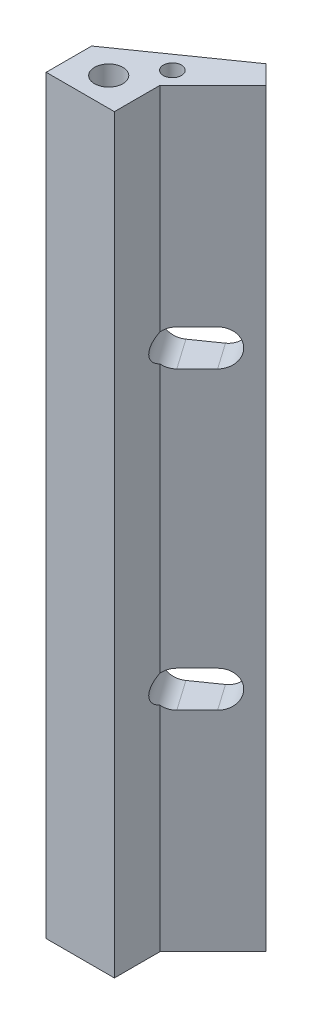
ISO-10303-21;
HEADER;
FILE_DESCRIPTION(('STEP AP214'),'2;1');
FILE_NAME('part.step','',(''),(''),'','','');
FILE_SCHEMA(('AUTOMOTIVE_DESIGN { 1 0 10303 214 1 1 1 1 }'));
ENDSEC;
DATA;
#1=APPLICATION_CONTEXT('core data for automotive mechanical design processes');
#2=APPLICATION_PROTOCOL_DEFINITION('international standard','automotive_design',2000,#1);
#3=PRODUCT_CONTEXT('',#1,'mechanical');
#4=PRODUCT('Part','Part','',(#3));
#5=PRODUCT_RELATED_PRODUCT_CATEGORY('part','',(#4));
#6=PRODUCT_DEFINITION_FORMATION('','',#4);
#7=PRODUCT_DEFINITION_CONTEXT('part definition',#1,'design');
#8=PRODUCT_DEFINITION('design','',#6,#7);
#9=PRODUCT_DEFINITION_SHAPE('','',#8);
#10=(LENGTH_UNIT() NAMED_UNIT(*) SI_UNIT(.MILLI.,.METRE.));
#11=(NAMED_UNIT(*) PLANE_ANGLE_UNIT() SI_UNIT($,.RADIAN.));
#12=(NAMED_UNIT(*) SI_UNIT($,.STERADIAN.) SOLID_ANGLE_UNIT());
#13=UNCERTAINTY_MEASURE_WITH_UNIT(LENGTH_MEASURE(1.E-05),#10,'distance_accuracy_value','');
#14=(GEOMETRIC_REPRESENTATION_CONTEXT(3) GLOBAL_UNCERTAINTY_ASSIGNED_CONTEXT((#13)) GLOBAL_UNIT_ASSIGNED_CONTEXT((#10,
#11,#12)) REPRESENTATION_CONTEXT('',''));
#15=CARTESIAN_POINT('',(0.,0.,0.));
#16=DIRECTION('',(0.,0.,1.));
#17=DIRECTION('',(1.,0.,0.));
#18=AXIS2_PLACEMENT_3D('',#15,#16,#17);
#19=CARTESIAN_POINT('',(5.47915868760944,0.,0.366416920686563));
#20=DIRECTION('',(0.707106781186549,0.,-0.707106781186546));
#21=DIRECTION('',(-0.707106781186546,0.,-0.707106781186549));
#22=AXIS2_PLACEMENT_3D('',#19,#20,#21);
#23=PLANE('',#22);
#24=DIRECTION('',(-0.707106781186546,0.,-0.707106781186549));
#25=VECTOR('',#24,1.);
#26=CARTESIAN_POINT('',(5.47915868760944,66.,0.366416920686563));
#27=LINE('',#26,#25);
#28=CARTESIAN_POINT('',(5.47915868760944,66.,0.366416920686563));
#29=VERTEX_POINT('',#28);
#30=CARTESIAN_POINT('',(3.82982453323733,66.,-1.28291723368555));
#31=VERTEX_POINT('',#30);
#32=EDGE_CURVE('E253',#29,#31,#27,.T.);
#33=ORIENTED_EDGE('',*,*,#32,.F.);
#34=DIRECTION('',(0.,1.,0.));
#35=VECTOR('',#34,1.);
#36=CARTESIAN_POINT('',(5.47915868760944,0.,0.366416920686563));
#37=LINE('',#36,#35);
#38=CARTESIAN_POINT('',(5.47915868760944,0.,0.366416920686563));
#39=VERTEX_POINT('',#38);
#40=EDGE_CURVE('E11',#39,#29,#37,.T.);
#41=ORIENTED_EDGE('',*,*,#40,.F.);
#42=DIRECTION('',(-0.707106781186546,0.,-0.707106781186549));
#43=VECTOR('',#42,1.);
#44=CARTESIAN_POINT('',(5.47915868760944,0.,0.366416920686563));
#45=LINE('',#44,#43);
#46=CARTESIAN_POINT('',(3.82982453323733,0.,-1.28291723368555));
#47=VERTEX_POINT('',#46);
#48=EDGE_CURVE('E254',#39,#47,#45,.T.);
#49=ORIENTED_EDGE('',*,*,#48,.T.);
#50=DIRECTION('',(0.,1.,0.));
#51=VECTOR('',#50,1.);
#52=CARTESIAN_POINT('',(3.82982453323733,0.,-1.28291723368555));
#53=LINE('',#52,#51);
#54=EDGE_CURVE('E35',#47,#31,#53,.T.);
#55=ORIENTED_EDGE('',*,*,#54,.T.);
#56=EDGE_LOOP('',(#33,#41,#49,#55));
#57=FACE_BOUND('',#56,.T.);
#58=ADVANCED_FACE('F32',(#57),#23,.T.);
#59=CARTESIAN_POINT('',(0.819152044436446,0.,5.02642356385954));
#60=DIRECTION('',(0.707106781186546,0.,0.707106781186549));
#61=DIRECTION('',(0.707106781186549,0.,-0.707106781186546));
#62=AXIS2_PLACEMENT_3D('',#59,#60,#61);
#63=PLANE('',#62);
#64=CARTESIAN_POINT('',(1.56447055593982,19.999999999,4.28110505235617));
#65=DIRECTION('',(0.707106781186546,0.,0.707106781186549));
#66=DIRECTION('',(0.707106781186549,0.,-0.707106781186546));
#67=AXIS2_PLACEMENT_3D('',#64,#65,#66);
#68=ELLIPSE('',#67,1.62468257104032,1.59999999207179);
#69=CARTESIAN_POINT('',(1.56447055593982,21.5999999910718,4.28110505235617));
#70=VERTEX_POINT('',#69);
#71=CARTESIAN_POINT('',(0.819152044436446,21.217580114483,5.02642356385954));
#72=VERTEX_POINT('',#71);
#73=EDGE_CURVE('E48',#70,#72,#68,.T.);
#74=ORIENTED_EDGE('',*,*,#73,.F.);
#75=DIRECTION('',(-0.707106781186549,0.,0.707106781186546));
#76=VECTOR('',#75,1.);
#77=CARTESIAN_POINT('',(0.819152044436488,21.5999999910718,5.0264235638595));
#78=LINE('',#77,#76);
#79=CARTESIAN_POINT('',(3.35950816367542,21.5999999910718,2.48606744462057));
#80=VERTEX_POINT('',#79);
#81=EDGE_CURVE('E193',#80,#70,#78,.T.);
#82=ORIENTED_EDGE('',*,*,#81,.F.);
#83=CARTESIAN_POINT('',(3.35950816367542,19.999999999,2.48606744462057));
#84=DIRECTION('',(0.707106781186546,0.,0.707106781186549));
#85=DIRECTION('',(0.707106781186549,0.,-0.707106781186546));
#86=AXIS2_PLACEMENT_3D('',#83,#84,#85);
#87=ELLIPSE('',#86,1.62468257104032,1.59999999207178);
#88=CARTESIAN_POINT('',(3.35950816367542,18.4000000069282,2.48606744462057));
#89=VERTEX_POINT('',#88);
#90=EDGE_CURVE('E195',#89,#80,#87,.T.);
#91=ORIENTED_EDGE('',*,*,#90,.F.);
#92=DIRECTION('',(0.707106781186549,0.,-0.707106781186546));
#93=VECTOR('',#92,1.);
#94=CARTESIAN_POINT('',(0.819152044436446,18.4000000069282,5.02642356385954));
#95=LINE('',#94,#93);
#96=CARTESIAN_POINT('',(1.56447055593982,18.4000000069282,4.28110505235616));
#97=VERTEX_POINT('',#96);
#98=EDGE_CURVE('E186',#97,#89,#95,.T.);
#99=ORIENTED_EDGE('',*,*,#98,.F.);
#100=CARTESIAN_POINT('',(0.819152044436446,18.7824198835169,5.02642356385954));
#101=VERTEX_POINT('',#100);
#102=EDGE_CURVE('E165',#101,#97,#68,.T.);
#103=ORIENTED_EDGE('',*,*,#102,.F.);
#104=DIRECTION('',(0.,1.,0.));
#105=VECTOR('',#104,1.);
#106=CARTESIAN_POINT('',(0.819152044436446,0.,5.02642356385954));
#107=LINE('',#106,#105);
#108=CARTESIAN_POINT('',(0.819152044436446,0.,5.02642356385954));
#109=VERTEX_POINT('',#108);
#110=EDGE_CURVE('E40',#109,#101,#107,.T.);
#111=ORIENTED_EDGE('',*,*,#110,.F.);
#112=DIRECTION('',(0.707106781186549,0.,-0.707106781186546));
#113=VECTOR('',#112,1.);
#114=CARTESIAN_POINT('',(0.819152044436446,0.,5.02642356385954));
#115=LINE('',#114,#113);
#116=EDGE_CURVE('E270',#109,#39,#115,.T.);
#117=ORIENTED_EDGE('',*,*,#116,.T.);
#118=ORIENTED_EDGE('',*,*,#40,.T.);
#119=DIRECTION('',(0.707106781186549,0.,-0.707106781186546));
#120=VECTOR('',#119,1.);
#121=CARTESIAN_POINT('',(0.819152044436446,66.,5.02642356385954));
#122=LINE('',#121,#120);
#123=CARTESIAN_POINT('',(0.819152044436446,66.,5.02642356385954));
#124=VERTEX_POINT('',#123);
#125=EDGE_CURVE('E258',#124,#29,#122,.T.);
#126=ORIENTED_EDGE('',*,*,#125,.F.);
#127=CARTESIAN_POINT('',(0.819152044436446,47.2175801164831,5.02642356385954));
#128=VERTEX_POINT('',#127);
#129=EDGE_CURVE('E292',#128,#124,#107,.T.);
#130=ORIENTED_EDGE('',*,*,#129,.F.);
#131=CARTESIAN_POINT('',(1.56447055593982,46.000000001,4.28110505235617));
#132=DIRECTION('',(0.707106781186546,0.,0.707106781186549));
#133=DIRECTION('',(0.707106781186549,0.,-0.707106781186546));
#134=AXIS2_PLACEMENT_3D('',#131,#132,#133);
#135=ELLIPSE('',#134,1.62468257104032,1.59999999207179);
#136=CARTESIAN_POINT('',(1.56447055593982,47.5999999930718,4.28110505235617));
#137=VERTEX_POINT('',#136);
#138=EDGE_CURVE('E224',#137,#128,#135,.T.);
#139=ORIENTED_EDGE('',*,*,#138,.F.);
#140=DIRECTION('',(-0.707106781186549,0.,0.707106781186546));
#141=VECTOR('',#140,1.);
#142=CARTESIAN_POINT('',(0.819152044436446,47.5999999930718,5.02642356385954));
#143=LINE('',#142,#141);
#144=CARTESIAN_POINT('',(3.35950816367542,47.5999999930718,2.48606744462057));
#145=VERTEX_POINT('',#144);
#146=EDGE_CURVE('E225',#145,#137,#143,.T.);
#147=ORIENTED_EDGE('',*,*,#146,.F.);
#148=CARTESIAN_POINT('',(3.35950816367542,46.000000001,2.48606744462057));
#149=DIRECTION('',(0.707106781186546,0.,0.707106781186549));
#150=DIRECTION('',(0.707106781186549,0.,-0.707106781186546));
#151=AXIS2_PLACEMENT_3D('',#148,#149,#150);
#152=ELLIPSE('',#151,1.62468257104032,1.59999999207178);
#153=CARTESIAN_POINT('',(3.35950816367542,44.4000000089282,2.48606744462057));
#154=VERTEX_POINT('',#153);
#155=EDGE_CURVE('E227',#154,#145,#152,.T.);
#156=ORIENTED_EDGE('',*,*,#155,.F.);
#157=DIRECTION('',(0.707106781186549,0.,-0.707106781186546));
#158=VECTOR('',#157,1.);
#159=CARTESIAN_POINT('',(0.81915204443636,44.4000000089282,5.02642356385963));
#160=LINE('',#159,#158);
#161=CARTESIAN_POINT('',(1.56447055593982,44.4000000089282,4.28110505235616));
#162=VERTEX_POINT('',#161);
#163=EDGE_CURVE('E211',#162,#154,#160,.T.);
#164=ORIENTED_EDGE('',*,*,#163,.F.);
#165=CARTESIAN_POINT('',(0.819152044436446,44.782419885517,5.02642356385954));
#166=VERTEX_POINT('',#165);
#167=EDGE_CURVE('E222',#166,#162,#135,.T.);
#168=ORIENTED_EDGE('',*,*,#167,.F.);
#169=EDGE_CURVE('E291',#72,#166,#107,.T.);
#170=ORIENTED_EDGE('',*,*,#169,.F.);
#171=EDGE_LOOP('',(#74,#82,#91,#99,#103,#111,#117,#118,#126,#130,#139,#147,#156,#164,#168,#170));
#172=FACE_BOUND('',#171,.T.);
#173=ADVANCED_FACE('F310',(#172),#63,.T.);
#174=CARTESIAN_POINT('',(0.819152044436446,0.,9.02642356385954));
#175=DIRECTION('',(1.,0.,0.));
#176=DIRECTION('',(0.,0.,-1.));
#177=AXIS2_PLACEMENT_3D('',#174,#175,#176);
#178=PLANE('',#177);
#179=CARTESIAN_POINT('',(0.819152044436446,19.999999999,3.21667990518222));
#180=DIRECTION('',(1.,0.,0.));
#181=DIRECTION('',(0.,0.,-1.));
#182=AXIS2_PLACEMENT_3D('',#179,#180,#181);
#183=ELLIPSE('',#182,2.78951486019549,1.59999999207179);
#184=EDGE_CURVE('E190',#72,#101,#183,.T.);
#185=ORIENTED_EDGE('',*,*,#184,.F.);
#186=ORIENTED_EDGE('',*,*,#169,.T.);
#187=CARTESIAN_POINT('',(0.819152044436446,46.000000001,3.21667990518222));
#188=DIRECTION('',(1.,0.,0.));
#189=DIRECTION('',(0.,0.,-1.));
#190=AXIS2_PLACEMENT_3D('',#187,#188,#189);
#191=ELLIPSE('',#190,2.78951486019549,1.59999999207179);
#192=EDGE_CURVE('E219',#128,#166,#191,.T.);
#193=ORIENTED_EDGE('',*,*,#192,.F.);
#194=ORIENTED_EDGE('',*,*,#129,.T.);
#195=DIRECTION('',(0.,0.,-1.));
#196=VECTOR('',#195,1.);
#197=CARTESIAN_POINT('',(0.819152044436446,66.,9.02642356385954));
#198=LINE('',#197,#196);
#199=CARTESIAN_POINT('',(0.819152044436446,66.,9.02642356385954));
#200=VERTEX_POINT('',#199);
#201=EDGE_CURVE('E284',#200,#124,#198,.T.);
#202=ORIENTED_EDGE('',*,*,#201,.F.);
#203=DIRECTION('',(0.,1.,0.));
#204=VECTOR('',#203,1.);
#205=CARTESIAN_POINT('',(0.819152044436446,0.,9.02642356385954));
#206=LINE('',#205,#204);
#207=CARTESIAN_POINT('',(0.819152044436446,0.,9.02642356385954));
#208=VERTEX_POINT('',#207);
#209=EDGE_CURVE('E293',#208,#200,#206,.T.);
#210=ORIENTED_EDGE('',*,*,#209,.F.);
#211=DIRECTION('',(0.,0.,-1.));
#212=VECTOR('',#211,1.);
#213=CARTESIAN_POINT('',(0.819152044436446,0.,9.02642356385954));
#214=LINE('',#213,#212);
#215=EDGE_CURVE('E267',#208,#109,#214,.T.);
#216=ORIENTED_EDGE('',*,*,#215,.T.);
#217=ORIENTED_EDGE('',*,*,#110,.T.);
#218=EDGE_LOOP('',(#185,#186,#193,#194,#202,#210,#216,#217));
#219=FACE_BOUND('',#218,.T.);
#220=ADVANCED_FACE('F324',(#219),#178,.T.);
#221=CARTESIAN_POINT('',(-5.18084795556355,0.,9.02642356385954));
#222=DIRECTION('',(0.,0.,1.));
#223=DIRECTION('',(1.,0.,0.));
#224=AXIS2_PLACEMENT_3D('',#221,#222,#223);
#225=PLANE('',#224);
#226=DIRECTION('',(1.,0.,0.));
#227=VECTOR('',#226,1.);
#228=CARTESIAN_POINT('',(-5.18084795556355,66.,9.02642356385954));
#229=LINE('',#228,#227);
#230=CARTESIAN_POINT('',(-5.18084795556355,66.,9.02642356385954));
#231=VERTEX_POINT('',#230);
#232=EDGE_CURVE('E281',#231,#200,#229,.T.);
#233=ORIENTED_EDGE('',*,*,#232,.F.);
#234=DIRECTION('',(0.,1.,0.));
#235=VECTOR('',#234,1.);
#236=CARTESIAN_POINT('',(-5.18084795556355,0.,9.02642356385954));
#237=LINE('',#236,#235);
#238=CARTESIAN_POINT('',(-5.18084795556355,0.,9.02642356385954));
#239=VERTEX_POINT('',#238);
#240=EDGE_CURVE('E295',#239,#231,#237,.T.);
#241=ORIENTED_EDGE('',*,*,#240,.F.);
#242=DIRECTION('',(1.,0.,0.));
#243=VECTOR('',#242,1.);
#244=CARTESIAN_POINT('',(-5.18084795556355,0.,9.02642356385954));
#245=LINE('',#244,#243);
#246=EDGE_CURVE('E264',#239,#208,#245,.T.);
#247=ORIENTED_EDGE('',*,*,#246,.T.);
#248=ORIENTED_EDGE('',*,*,#209,.T.);
#249=EDGE_LOOP('',(#233,#241,#247,#248));
#250=FACE_BOUND('',#249,.T.);
#251=ADVANCED_FACE('F322',(#250),#225,.T.);
#252=CARTESIAN_POINT('',(-5.18084795556355,0.,5.02642356385954));
#253=DIRECTION('',(-1.,0.,0.));
#254=DIRECTION('',(0.,0.,1.));
#255=AXIS2_PLACEMENT_3D('',#252,#253,#254);
#256=PLANE('',#255);
#257=DIRECTION('',(0.,0.,1.));
#258=VECTOR('',#257,1.);
#259=CARTESIAN_POINT('',(-5.18084795556355,66.,5.02642356385954));
#260=LINE('',#259,#258);
#261=CARTESIAN_POINT('',(-5.18084795556355,66.,5.02642356385954));
#262=VERTEX_POINT('',#261);
#263=EDGE_CURVE('E278',#262,#231,#260,.T.);
#264=ORIENTED_EDGE('',*,*,#263,.F.);
#265=DIRECTION('',(0.,1.,0.));
#266=VECTOR('',#265,1.);
#267=CARTESIAN_POINT('',(-5.18084795556355,0.,5.02642356385954));
#268=LINE('',#267,#266);
#269=CARTESIAN_POINT('',(-5.18084795556355,0.,5.02642356385954));
#270=VERTEX_POINT('',#269);
#271=EDGE_CURVE('E296',#270,#262,#268,.T.);
#272=ORIENTED_EDGE('',*,*,#271,.F.);
#273=DIRECTION('',(0.,0.,1.));
#274=VECTOR('',#273,1.);
#275=CARTESIAN_POINT('',(-5.18084795556355,0.,5.02642356385954));
#276=LINE('',#275,#274);
#277=EDGE_CURVE('E261',#270,#239,#276,.T.);
#278=ORIENTED_EDGE('',*,*,#277,.T.);
#279=ORIENTED_EDGE('',*,*,#240,.T.);
#280=EDGE_LOOP('',(#264,#272,#278,#279));
#281=FACE_BOUND('',#280,.T.);
#282=ADVANCED_FACE('F319',(#281),#256,.T.);
#283=CARTESIAN_POINT('',(3.82982453323733,0.,-1.28291723368555));
#284=DIRECTION('',(-0.573576436140462,0.,-0.819152044436444));
#285=DIRECTION('',(-0.819152044436444,0.,0.573576436140462));
#286=AXIS2_PLACEMENT_3D('',#283,#284,#285);
#287=PLANE('',#286);
#288=CARTESIAN_POINT('',(1.74339396758146,19.999999999,0.178017175538498));
#289=DIRECTION('',(-0.573576436140462,0.,-0.819152044436444));
#290=DIRECTION('',(0.819152044436444,0.,-0.573576436140462));
#291=AXIS2_PLACEMENT_3D('',#288,#289,#290);
#292=CIRCLE('',#291,1.59999999207178);
#293=CARTESIAN_POINT('',(1.74339396758146,21.5999999910718,0.178017175538498));
#294=VERTEX_POINT('',#293);
#295=CARTESIAN_POINT('',(1.74339396758145,18.4000000069282,0.178017175538499));
#296=VERTEX_POINT('',#295);
#297=EDGE_CURVE('E56',#294,#296,#292,.T.);
#298=ORIENTED_EDGE('',*,*,#297,.F.);
#299=DIRECTION('',(0.819152044436444,0.,-0.573576436140462));
#300=VECTOR('',#299,1.);
#301=CARTESIAN_POINT('',(1.74339396758146,21.5999999910718,0.178017175538498));
#302=LINE('',#301,#300);
#303=CARTESIAN_POINT('',(-0.304486143509655,21.5999999910718,1.61195826588965));
#304=VERTEX_POINT('',#303);
#305=EDGE_CURVE('E179',#304,#294,#302,.T.);
#306=ORIENTED_EDGE('',*,*,#305,.F.);
#307=CARTESIAN_POINT('',(-0.304486143509655,19.999999999,1.61195826588965));
#308=DIRECTION('',(-0.573576436140462,0.,-0.819152044436444));
#309=DIRECTION('',(0.819152044436444,0.,-0.573576436140462));
#310=AXIS2_PLACEMENT_3D('',#307,#308,#309);
#311=CIRCLE('',#310,1.59999999207179);
#312=CARTESIAN_POINT('',(-0.304486143509655,18.4000000069282,1.61195826588965));
#313=VERTEX_POINT('',#312);
#314=EDGE_CURVE('E162',#313,#304,#311,.T.);
#315=ORIENTED_EDGE('',*,*,#314,.F.);
#316=DIRECTION('',(-0.819152044436444,0.,0.573576436140462));
#317=VECTOR('',#316,1.);
#318=CARTESIAN_POINT('',(1.74339396758145,18.4000000069282,0.178017175538498));
#319=LINE('',#318,#317);
#320=EDGE_CURVE('E172',#296,#313,#319,.T.);
#321=ORIENTED_EDGE('',*,*,#320,.F.);
#322=EDGE_LOOP('',(#298,#306,#315,#321));
#323=FACE_BOUND('',#322,.T.);
#324=CARTESIAN_POINT('',(1.74339396758146,46.000000001,0.178017175538498));
#325=DIRECTION('',(-0.573576436140462,0.,-0.819152044436444));
#326=DIRECTION('',(-0.819152044436444,0.,0.573576436140462));
#327=AXIS2_PLACEMENT_3D('',#324,#325,#326);
#328=CIRCLE('',#327,1.59999999207178);
#329=CARTESIAN_POINT('',(1.74339396758145,47.5999999930718,0.178017175538498));
#330=VERTEX_POINT('',#329);
#331=CARTESIAN_POINT('',(1.74339396758145,44.4000000089282,0.178017175538498));
#332=VERTEX_POINT('',#331);
#333=EDGE_CURVE('E197',#330,#332,#328,.T.);
#334=ORIENTED_EDGE('',*,*,#333,.F.);
#335=DIRECTION('',(0.819152044436444,0.,-0.573576436140462));
#336=VECTOR('',#335,1.);
#337=CARTESIAN_POINT('',(1.74339396758145,47.5999999930718,0.178017175538498));
#338=LINE('',#337,#336);
#339=CARTESIAN_POINT('',(-0.304486143509655,47.5999999930718,1.61195826588965));
#340=VERTEX_POINT('',#339);
#341=EDGE_CURVE('E205',#340,#330,#338,.T.);
#342=ORIENTED_EDGE('',*,*,#341,.F.);
#343=CARTESIAN_POINT('',(-0.304486143509655,46.000000001,1.61195826588965));
#344=DIRECTION('',(-0.573576436140462,0.,-0.819152044436444));
#345=DIRECTION('',(0.819152044436444,0.,-0.573576436140462));
#346=AXIS2_PLACEMENT_3D('',#343,#344,#345);
#347=CIRCLE('',#346,1.59999999207179);
#348=CARTESIAN_POINT('',(-0.304486143509655,44.4000000089282,1.61195826588965));
#349=VERTEX_POINT('',#348);
#350=EDGE_CURVE('E202',#349,#340,#347,.T.);
#351=ORIENTED_EDGE('',*,*,#350,.F.);
#352=DIRECTION('',(-0.819152044436444,0.,0.573576436140462));
#353=VECTOR('',#352,1.);
#354=CARTESIAN_POINT('',(1.74339396758146,44.4000000089282,0.178017175538498));
#355=LINE('',#354,#353);
#356=EDGE_CURVE('E199',#332,#349,#355,.T.);
#357=ORIENTED_EDGE('',*,*,#356,.F.);
#358=EDGE_LOOP('',(#334,#342,#351,#357));
#359=FACE_BOUND('',#358,.T.);
#360=DIRECTION('',(-0.819152044436444,0.,0.573576436140462));
#361=VECTOR('',#360,1.);
#362=CARTESIAN_POINT('',(3.82982453323733,66.,-1.28291723368555));
#363=LINE('',#362,#361);
#364=EDGE_CURVE('E275',#31,#262,#363,.T.);
#365=ORIENTED_EDGE('',*,*,#364,.F.);
#366=ORIENTED_EDGE('',*,*,#54,.F.);
#367=DIRECTION('',(-0.819152044436444,0.,0.573576436140462));
#368=VECTOR('',#367,1.);
#369=CARTESIAN_POINT('',(3.82982453323733,0.,-1.28291723368555));
#370=LINE('',#369,#368);
#371=EDGE_CURVE('E257',#47,#270,#370,.T.);
#372=ORIENTED_EDGE('',*,*,#371,.T.);
#373=ORIENTED_EDGE('',*,*,#271,.T.);
#374=EDGE_LOOP('',(#365,#366,#372,#373));
#375=FACE_BOUND('',#374,.T.);
#376=ADVANCED_FACE('F176',(#323,#359,#375),#287,.T.);
#377=CARTESIAN_POINT('',(0.,0.,0.));
#378=DIRECTION('',(0.,-1.,0.));
#379=DIRECTION('',(0.,0.,-1.));
#380=AXIS2_PLACEMENT_3D('',#377,#378,#379);
#381=PLANE('',#380);
#382=CARTESIAN_POINT('',(0.219152044436446,0.,3.32642356385954));
#383=DIRECTION('',(0.,-1.,0.));
#384=DIRECTION('',(0.,0.,-1.));
#385=AXIS2_PLACEMENT_3D('',#382,#383,#384);
#386=CIRCLE('',#385,0.799999999999999);
#387=CARTESIAN_POINT('',(0.219152044436446,0.,2.52642356385954));
#388=VERTEX_POINT('',#387);
#389=EDGE_CURVE('E241',#388,#388,#386,.T.);
#390=ORIENTED_EDGE('',*,*,#389,.F.);
#391=EDGE_LOOP('',(#390));
#392=FACE_BOUND('',#391,.T.);
#393=CARTESIAN_POINT('',(-2.18084795556355,0.,6.52642356385954));
#394=DIRECTION('',(0.,-1.,0.));
#395=DIRECTION('',(0.,0.,-1.));
#396=AXIS2_PLACEMENT_3D('',#393,#394,#395);
#397=CIRCLE('',#396,1.24999999999999);
#398=CARTESIAN_POINT('',(-2.18084795556355,0.,5.27642356385955));
#399=VERTEX_POINT('',#398);
#400=EDGE_CURVE('E247',#399,#399,#397,.T.);
#401=ORIENTED_EDGE('',*,*,#400,.F.);
#402=EDGE_LOOP('',(#401));
#403=FACE_BOUND('',#402,.T.);
#404=ORIENTED_EDGE('',*,*,#48,.F.);
#405=ORIENTED_EDGE('',*,*,#116,.F.);
#406=ORIENTED_EDGE('',*,*,#215,.F.);
#407=ORIENTED_EDGE('',*,*,#246,.F.);
#408=ORIENTED_EDGE('',*,*,#277,.F.);
#409=ORIENTED_EDGE('',*,*,#371,.F.);
#410=EDGE_LOOP('',(#404,#405,#406,#407,#408,#409));
#411=FACE_BOUND('',#410,.T.);
#412=ADVANCED_FACE('F314',(#392,#403,#411),#381,.T.);
#413=CARTESIAN_POINT('',(0.,66.,0.));
#414=DIRECTION('',(0.,-1.,0.));
#415=DIRECTION('',(0.,0.,-1.));
#416=AXIS2_PLACEMENT_3D('',#413,#414,#415);
#417=PLANE('',#416);
#418=CARTESIAN_POINT('',(0.219152044436446,66.,3.32642356385954));
#419=DIRECTION('',(0.,1.,0.));
#420=DIRECTION('',(0.,0.,1.));
#421=AXIS2_PLACEMENT_3D('',#418,#419,#420);
#422=CIRCLE('',#421,0.799999999999999);
#423=CARTESIAN_POINT('',(0.219152044436446,66.,4.12642356385954));
#424=VERTEX_POINT('',#423);
#425=EDGE_CURVE('E229',#424,#424,#422,.T.);
#426=ORIENTED_EDGE('',*,*,#425,.F.);
#427=EDGE_LOOP('',(#426));
#428=FACE_BOUND('',#427,.T.);
#429=CARTESIAN_POINT('',(-2.18084795556355,66.,6.52642356385954));
#430=DIRECTION('',(0.,1.,0.));
#431=DIRECTION('',(0.,0.,1.));
#432=AXIS2_PLACEMENT_3D('',#429,#430,#431);
#433=CIRCLE('',#432,1.24999999999999);
#434=CARTESIAN_POINT('',(-2.18084795556355,66.,7.77642356385953));
#435=VERTEX_POINT('',#434);
#436=EDGE_CURVE('E235',#435,#435,#433,.T.);
#437=ORIENTED_EDGE('',*,*,#436,.F.);
#438=EDGE_LOOP('',(#437));
#439=FACE_BOUND('',#438,.T.);
#440=ORIENTED_EDGE('',*,*,#32,.T.);
#441=ORIENTED_EDGE('',*,*,#364,.T.);
#442=ORIENTED_EDGE('',*,*,#263,.T.);
#443=ORIENTED_EDGE('',*,*,#232,.T.);
#444=ORIENTED_EDGE('',*,*,#201,.T.);
#445=ORIENTED_EDGE('',*,*,#125,.T.);
#446=EDGE_LOOP('',(#440,#441,#442,#443,#444,#445));
#447=FACE_BOUND('',#446,.T.);
#448=ADVANCED_FACE('F305',(#428,#439,#447),#417,.F.);
#449=CARTESIAN_POINT('',(-2.18084795556355,7.5,6.52642356385954));
#450=DIRECTION('',(0.,-1.,0.));
#451=DIRECTION('',(0.,0.,-1.));
#452=AXIS2_PLACEMENT_3D('',#449,#450,#451);
#453=CONICAL_SURFACE('',#452,1.25,1.02974425867665);
#454=CARTESIAN_POINT('',(-2.18084795556356,8.25107577378445,6.52642356385954));
#455=VERTEX_POINT('',#454);
#456=VERTEX_LOOP('',#455);
#457=FACE_BOUND('',#456,.T.);
#458=CARTESIAN_POINT('',(-2.18084795556355,7.5,6.52642356385954));
#459=DIRECTION('',(0.,-1.,0.));
#460=DIRECTION('',(0.,0.,-1.));
#461=AXIS2_PLACEMENT_3D('',#458,#459,#460);
#462=CIRCLE('',#461,1.25);
#463=CARTESIAN_POINT('',(-2.18084795556355,7.5,5.27642356385954));
#464=VERTEX_POINT('',#463);
#465=EDGE_CURVE('E250',#464,#464,#462,.T.);
#466=ORIENTED_EDGE('',*,*,#465,.T.);
#467=EDGE_LOOP('',(#466));
#468=FACE_BOUND('',#467,.T.);
#469=ADVANCED_FACE('F380',(#457,#468),#453,.F.);
#470=CARTESIAN_POINT('',(-2.18084795556355,0.,6.52642356385954));
#471=DIRECTION('',(0.,-1.,0.));
#472=DIRECTION('',(0.,0.,-1.));
#473=AXIS2_PLACEMENT_3D('',#470,#471,#472);
#474=CYLINDRICAL_SURFACE('',#473,1.24999999999999);
#475=ORIENTED_EDGE('',*,*,#465,.F.);
#476=EDGE_LOOP('',(#475));
#477=FACE_BOUND('',#476,.T.);
#478=ORIENTED_EDGE('',*,*,#400,.T.);
#479=EDGE_LOOP('',(#478));
#480=FACE_BOUND('',#479,.T.);
#481=ADVANCED_FACE('F387',(#477,#480),#474,.F.);
#482=CARTESIAN_POINT('',(0.219152044436446,5.2,3.32642356385954));
#483=DIRECTION('',(0.,-1.,0.));
#484=DIRECTION('',(0.,0.,-1.));
#485=AXIS2_PLACEMENT_3D('',#482,#483,#484);
#486=CONICAL_SURFACE('',#485,0.799999999999999,1.02974425867665);
#487=CARTESIAN_POINT('',(0.219152044436445,5.68068849522205,3.32642356385954));
#488=VERTEX_POINT('',#487);
#489=VERTEX_LOOP('',#488);
#490=FACE_BOUND('',#489,.T.);
#491=CARTESIAN_POINT('',(0.219152044436446,5.2,3.32642356385954));
#492=DIRECTION('',(0.,-1.,0.));
#493=DIRECTION('',(0.,0.,-1.));
#494=AXIS2_PLACEMENT_3D('',#491,#492,#493);
#495=CIRCLE('',#494,0.799999999999999);
#496=CARTESIAN_POINT('',(0.219152044436446,5.2,2.52642356385954));
#497=VERTEX_POINT('',#496);
#498=EDGE_CURVE('E244',#497,#497,#495,.T.);
#499=ORIENTED_EDGE('',*,*,#498,.T.);
#500=EDGE_LOOP('',(#499));
#501=FACE_BOUND('',#500,.T.);
#502=ADVANCED_FACE('F391',(#490,#501),#486,.F.);
#503=CARTESIAN_POINT('',(0.219152044436446,0.,3.32642356385954));
#504=DIRECTION('',(0.,-1.,0.));
#505=DIRECTION('',(0.,0.,-1.));
#506=AXIS2_PLACEMENT_3D('',#503,#504,#505);
#507=CYLINDRICAL_SURFACE('',#506,0.799999999999999);
#508=ORIENTED_EDGE('',*,*,#498,.F.);
#509=EDGE_LOOP('',(#508));
#510=FACE_BOUND('',#509,.T.);
#511=ORIENTED_EDGE('',*,*,#389,.T.);
#512=EDGE_LOOP('',(#511));
#513=FACE_BOUND('',#512,.T.);
#514=ADVANCED_FACE('F395',(#510,#513),#507,.F.);
#515=CARTESIAN_POINT('',(-2.18084795556355,58.5,6.52642356385954));
#516=DIRECTION('',(0.,1.,0.));
#517=DIRECTION('',(0.,0.,1.));
#518=AXIS2_PLACEMENT_3D('',#515,#516,#517);
#519=CONICAL_SURFACE('',#518,1.24999999999999,1.02974425867665);
#520=CARTESIAN_POINT('',(-2.18084795556356,57.7489242262155,6.52642356385954));
#521=VERTEX_POINT('',#520);
#522=VERTEX_LOOP('',#521);
#523=FACE_BOUND('',#522,.T.);
#524=CARTESIAN_POINT('',(-2.18084795556355,58.5,6.52642356385954));
#525=DIRECTION('',(0.,1.,0.));
#526=DIRECTION('',(0.,0.,1.));
#527=AXIS2_PLACEMENT_3D('',#524,#525,#526);
#528=CIRCLE('',#527,1.24999999999999);
#529=CARTESIAN_POINT('',(-2.18084795556355,58.5,7.77642356385952));
#530=VERTEX_POINT('',#529);
#531=EDGE_CURVE('E238',#530,#530,#528,.T.);
#532=ORIENTED_EDGE('',*,*,#531,.T.);
#533=EDGE_LOOP('',(#532));
#534=FACE_BOUND('',#533,.T.);
#535=ADVANCED_FACE('F399',(#523,#534),#519,.F.);
#536=CARTESIAN_POINT('',(-2.18084795556355,66.,6.52642356385954));
#537=DIRECTION('',(0.,1.,0.));
#538=DIRECTION('',(0.,0.,1.));
#539=AXIS2_PLACEMENT_3D('',#536,#537,#538);
#540=CYLINDRICAL_SURFACE('',#539,1.24999999999999);
#541=ORIENTED_EDGE('',*,*,#531,.F.);
#542=EDGE_LOOP('',(#541));
#543=FACE_BOUND('',#542,.T.);
#544=ORIENTED_EDGE('',*,*,#436,.T.);
#545=EDGE_LOOP('',(#544));
#546=FACE_BOUND('',#545,.T.);
#547=ADVANCED_FACE('F403',(#543,#546),#540,.F.);
#548=CARTESIAN_POINT('',(0.219152044436446,60.8,3.32642356385954));
#549=DIRECTION('',(0.,1.,0.));
#550=DIRECTION('',(0.,0.,1.));
#551=AXIS2_PLACEMENT_3D('',#548,#549,#550);
#552=CONICAL_SURFACE('',#551,0.799999999999999,1.02974425867666);
#553=CARTESIAN_POINT('',(0.219152044436445,60.319311504778,3.32642356385954));
#554=VERTEX_POINT('',#553);
#555=VERTEX_LOOP('',#554);
#556=FACE_BOUND('',#555,.T.);
#557=CARTESIAN_POINT('',(0.219152044436446,60.8,3.32642356385954));
#558=DIRECTION('',(0.,1.,0.));
#559=DIRECTION('',(0.,0.,1.));
#560=AXIS2_PLACEMENT_3D('',#557,#558,#559);
#561=CIRCLE('',#560,0.799999999999999);
#562=CARTESIAN_POINT('',(0.219152044436446,60.8,4.12642356385954));
#563=VERTEX_POINT('',#562);
#564=EDGE_CURVE('E232',#563,#563,#561,.T.);
#565=ORIENTED_EDGE('',*,*,#564,.T.);
#566=EDGE_LOOP('',(#565));
#567=FACE_BOUND('',#566,.T.);
#568=ADVANCED_FACE('F407',(#556,#567),#552,.F.);
#569=CARTESIAN_POINT('',(0.219152044436446,66.,3.32642356385954));
#570=DIRECTION('',(0.,1.,0.));
#571=DIRECTION('',(0.,0.,1.));
#572=AXIS2_PLACEMENT_3D('',#569,#570,#571);
#573=CYLINDRICAL_SURFACE('',#572,0.799999999999999);
#574=ORIENTED_EDGE('',*,*,#564,.F.);
#575=EDGE_LOOP('',(#574));
#576=FACE_BOUND('',#575,.T.);
#577=ORIENTED_EDGE('',*,*,#425,.T.);
#578=EDGE_LOOP('',(#577));
#579=FACE_BOUND('',#578,.T.);
#580=ADVANCED_FACE('F354',(#576,#579),#573,.F.);
#581=CARTESIAN_POINT('',(7.12981402783761,46.000000001,7.87062225227806));
#582=DIRECTION('',(-0.573576436140462,0.,-0.819152044436444));
#583=DIRECTION('',(-0.819152044436444,0.,0.573576436140462));
#584=AXIS2_PLACEMENT_3D('',#581,#582,#583);
#585=CYLINDRICAL_SURFACE('',#584,1.59999999207178);
#586=ORIENTED_EDGE('',*,*,#155,.T.);
#587=DIRECTION('',(-0.573576436140462,0.,-0.819152044436444));
#588=VECTOR('',#587,1.);
#589=CARTESIAN_POINT('',(7.12981402783761,47.5999999930718,7.87062225227806));
#590=LINE('',#589,#588);
#591=EDGE_CURVE('E209',#145,#330,#590,.T.);
#592=ORIENTED_EDGE('',*,*,#591,.T.);
#593=ORIENTED_EDGE('',*,*,#333,.T.);
#594=DIRECTION('',(-0.573576436140462,0.,-0.819152044436444));
#595=VECTOR('',#594,1.);
#596=CARTESIAN_POINT('',(7.12981402783761,44.4000000089282,7.87062225227806));
#597=LINE('',#596,#595);
#598=EDGE_CURVE('E208',#154,#332,#597,.T.);
#599=ORIENTED_EDGE('',*,*,#598,.F.);
#600=EDGE_LOOP('',(#586,#592,#593,#599));
#601=FACE_BOUND('',#600,.T.);
#602=ADVANCED_FACE('F340',(#601),#585,.F.);
#603=CARTESIAN_POINT('',(7.12981402783761,47.5999999930718,7.87062225227806));
#604=DIRECTION('',(0.,1.,0.));
#605=DIRECTION('',(0.,0.,1.));
#606=AXIS2_PLACEMENT_3D('',#603,#604,#605);
#607=PLANE('',#606);
#608=ORIENTED_EDGE('',*,*,#146,.T.);
#609=DIRECTION('',(-0.573576436140462,0.,-0.819152044436444));
#610=VECTOR('',#609,1.);
#611=CARTESIAN_POINT('',(5.0819339167465,47.5999999930718,9.30456334262921));
#612=LINE('',#611,#610);
#613=EDGE_CURVE('E212',#137,#340,#612,.T.);
#614=ORIENTED_EDGE('',*,*,#613,.T.);
#615=ORIENTED_EDGE('',*,*,#341,.T.);
#616=ORIENTED_EDGE('',*,*,#591,.F.);
#617=EDGE_LOOP('',(#608,#614,#615,#616));
#618=FACE_BOUND('',#617,.T.);
#619=ADVANCED_FACE('F346',(#618),#607,.F.);
#620=CARTESIAN_POINT('',(5.0819339167465,46.000000001,9.30456334262921));
#621=DIRECTION('',(-0.573576436140462,0.,-0.819152044436444));
#622=DIRECTION('',(-0.819152044436444,0.,0.573576436140462));
#623=AXIS2_PLACEMENT_3D('',#620,#621,#622);
#624=CYLINDRICAL_SURFACE('',#623,1.59999999207179);
#625=ORIENTED_EDGE('',*,*,#138,.T.);
#626=ORIENTED_EDGE('',*,*,#192,.T.);
#627=ORIENTED_EDGE('',*,*,#167,.T.);
#628=DIRECTION('',(-0.573576436140462,0.,-0.819152044436444));
#629=VECTOR('',#628,1.);
#630=CARTESIAN_POINT('',(5.0819339167465,44.4000000089282,9.30456334262921));
#631=LINE('',#630,#629);
#632=EDGE_CURVE('E214',#162,#349,#631,.T.);
#633=ORIENTED_EDGE('',*,*,#632,.T.);
#634=ORIENTED_EDGE('',*,*,#350,.T.);
#635=ORIENTED_EDGE('',*,*,#613,.F.);
#636=EDGE_LOOP('',(#625,#626,#627,#633,#634,#635));
#637=FACE_BOUND('',#636,.T.);
#638=ADVANCED_FACE('F329',(#637),#624,.F.);
#639=CARTESIAN_POINT('',(7.12981402783761,44.4000000089282,7.87062225227806));
#640=DIRECTION('',(0.,-1.,0.));
#641=DIRECTION('',(1.,0.,0.));
#642=AXIS2_PLACEMENT_3D('',#639,#640,#641);
#643=PLANE('',#642);
#644=ORIENTED_EDGE('',*,*,#163,.T.);
#645=ORIENTED_EDGE('',*,*,#598,.T.);
#646=ORIENTED_EDGE('',*,*,#356,.T.);
#647=ORIENTED_EDGE('',*,*,#632,.F.);
#648=EDGE_LOOP('',(#644,#645,#646,#647));
#649=FACE_BOUND('',#648,.T.);
#650=ADVANCED_FACE('F337',(#649),#643,.F.);
#651=CARTESIAN_POINT('',(7.12981402783761,19.999999999,7.87062225227806));
#652=DIRECTION('',(-0.573576436140462,0.,-0.819152044436444));
#653=DIRECTION('',(-0.819152044436444,0.,0.573576436140462));
#654=AXIS2_PLACEMENT_3D('',#651,#652,#653);
#655=CYLINDRICAL_SURFACE('',#654,1.59999999207178);
#656=ORIENTED_EDGE('',*,*,#90,.T.);
#657=DIRECTION('',(-0.573576436140462,0.,-0.819152044436444));
#658=VECTOR('',#657,1.);
#659=CARTESIAN_POINT('',(7.12981402783761,21.5999999910718,7.87062225227806));
#660=LINE('',#659,#658);
#661=EDGE_CURVE('E184',#80,#294,#660,.T.);
#662=ORIENTED_EDGE('',*,*,#661,.T.);
#663=ORIENTED_EDGE('',*,*,#297,.T.);
#664=DIRECTION('',(-0.573576436140462,0.,-0.819152044436444));
#665=VECTOR('',#664,1.);
#666=CARTESIAN_POINT('',(7.12981402783761,18.4000000069282,7.87062225227806));
#667=LINE('',#666,#665);
#668=EDGE_CURVE('E169',#89,#296,#667,.T.);
#669=ORIENTED_EDGE('',*,*,#668,.F.);
#670=EDGE_LOOP('',(#656,#662,#663,#669));
#671=FACE_BOUND('',#670,.T.);
#672=ADVANCED_FACE('F416',(#671),#655,.F.);
#673=CARTESIAN_POINT('',(7.12981402783761,21.5999999910718,7.87062225227806));
#674=DIRECTION('',(0.,1.,0.));
#675=DIRECTION('',(-1.,0.,0.));
#676=AXIS2_PLACEMENT_3D('',#673,#674,#675);
#677=PLANE('',#676);
#678=ORIENTED_EDGE('',*,*,#81,.T.);
#679=DIRECTION('',(-0.573576436140462,0.,-0.819152044436444));
#680=VECTOR('',#679,1.);
#681=CARTESIAN_POINT('',(5.0819339167465,21.5999999910718,9.30456334262921));
#682=LINE('',#681,#680);
#683=EDGE_CURVE('E168',#70,#304,#682,.T.);
#684=ORIENTED_EDGE('',*,*,#683,.T.);
#685=ORIENTED_EDGE('',*,*,#305,.T.);
#686=ORIENTED_EDGE('',*,*,#661,.F.);
#687=EDGE_LOOP('',(#678,#684,#685,#686));
#688=FACE_BOUND('',#687,.T.);
#689=ADVANCED_FACE('F420',(#688),#677,.F.);
#690=CARTESIAN_POINT('',(5.0819339167465,19.999999999,9.30456334262921));
#691=DIRECTION('',(-0.573576436140462,0.,-0.819152044436444));
#692=DIRECTION('',(-0.819152044436444,0.,0.573576436140462));
#693=AXIS2_PLACEMENT_3D('',#690,#691,#692);
#694=CYLINDRICAL_SURFACE('',#693,1.59999999207179);
#695=ORIENTED_EDGE('',*,*,#73,.T.);
#696=ORIENTED_EDGE('',*,*,#184,.T.);
#697=ORIENTED_EDGE('',*,*,#102,.T.);
#698=DIRECTION('',(-0.573576436140462,0.,-0.819152044436444));
#699=VECTOR('',#698,1.);
#700=CARTESIAN_POINT('',(5.0819339167465,18.4000000069282,9.30456334262921));
#701=LINE('',#700,#699);
#702=EDGE_CURVE('E158',#97,#313,#701,.T.);
#703=ORIENTED_EDGE('',*,*,#702,.T.);
#704=ORIENTED_EDGE('',*,*,#314,.T.);
#705=ORIENTED_EDGE('',*,*,#683,.F.);
#706=EDGE_LOOP('',(#695,#696,#697,#703,#704,#705));
#707=FACE_BOUND('',#706,.T.);
#708=ADVANCED_FACE('F160',(#707),#694,.F.);
#709=CARTESIAN_POINT('',(7.12981402783761,18.4000000069282,7.87062225227806));
#710=DIRECTION('',(0.,-1.,0.));
#711=DIRECTION('',(0.,0.,-1.));
#712=AXIS2_PLACEMENT_3D('',#709,#710,#711);
#713=PLANE('',#712);
#714=ORIENTED_EDGE('',*,*,#98,.T.);
#715=ORIENTED_EDGE('',*,*,#668,.T.);
#716=ORIENTED_EDGE('',*,*,#320,.T.);
#717=ORIENTED_EDGE('',*,*,#702,.F.);
#718=EDGE_LOOP('',(#714,#715,#716,#717));
#719=FACE_BOUND('',#718,.T.);
#720=ADVANCED_FACE('F173',(#719),#713,.F.);
#721=CLOSED_SHELL('',(#58,#173,#220,#251,#282,#376,#412,#448,#469,#481,#502,#514,#535,#547,#568,
#580,#602,#619,#638,#650,#672,#689,#708,#720));
#722=MANIFOLD_SOLID_BREP('B2',#721);
#723=ADVANCED_BREP_SHAPE_REPRESENTATION('',(#18,#722),#14);
#724=SHAPE_DEFINITION_REPRESENTATION(#9,#723);
ENDSEC;
END-ISO-10303-21;
